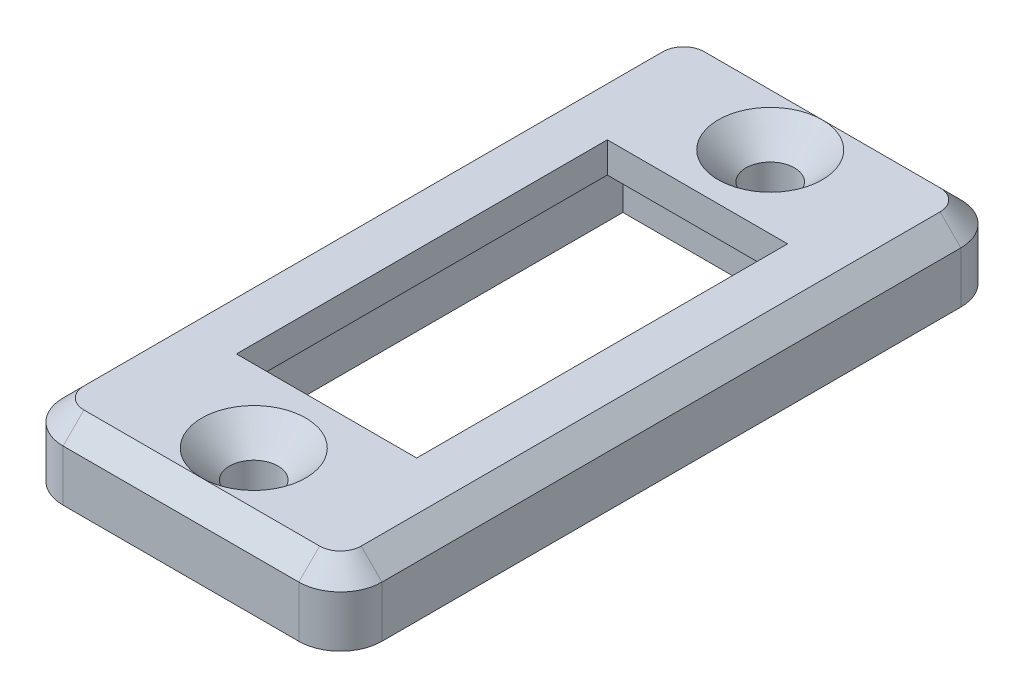
ISO-10303-21;
HEADER;
FILE_DESCRIPTION(('STEP AP214'),'2;1');
FILE_NAME('part.step','',(''),(''),'','','');
FILE_SCHEMA(('AUTOMOTIVE_DESIGN { 1 0 10303 214 1 1 1 1 }'));
ENDSEC;
DATA;
#1=APPLICATION_CONTEXT('core data for automotive mechanical design processes');
#2=APPLICATION_PROTOCOL_DEFINITION('international standard','automotive_design',2000,#1);
#3=PRODUCT_CONTEXT('',#1,'mechanical');
#4=PRODUCT('Part','Part','',(#3));
#5=PRODUCT_RELATED_PRODUCT_CATEGORY('part','',(#4));
#6=PRODUCT_DEFINITION_FORMATION('','',#4);
#7=PRODUCT_DEFINITION_CONTEXT('part definition',#1,'design');
#8=PRODUCT_DEFINITION('design','',#6,#7);
#9=PRODUCT_DEFINITION_SHAPE('','',#8);
#10=(LENGTH_UNIT() NAMED_UNIT(*) SI_UNIT(.MILLI.,.METRE.));
#11=(NAMED_UNIT(*) PLANE_ANGLE_UNIT() SI_UNIT($,.RADIAN.));
#12=(NAMED_UNIT(*) SI_UNIT($,.STERADIAN.) SOLID_ANGLE_UNIT());
#13=UNCERTAINTY_MEASURE_WITH_UNIT(LENGTH_MEASURE(1.E-05),#10,'distance_accuracy_value','');
#14=(GEOMETRIC_REPRESENTATION_CONTEXT(3) GLOBAL_UNCERTAINTY_ASSIGNED_CONTEXT((#13)) GLOBAL_UNIT_ASSIGNED_CONTEXT((#10,
#11,#12)) REPRESENTATION_CONTEXT('',''));
#15=CARTESIAN_POINT('',(0.,0.,0.));
#16=DIRECTION('',(0.,0.,1.));
#17=DIRECTION('',(1.,0.,0.));
#18=AXIS2_PLACEMENT_3D('',#15,#16,#17);
#19=CARTESIAN_POINT('',(8.5,0.,20.875));
#20=DIRECTION('',(0.,-1.,0.));
#21=DIRECTION('',(0.,0.,-1.));
#22=AXIS2_PLACEMENT_3D('',#19,#20,#21);
#23=PLANE('',#22);
#24=DIRECTION('',(-1.,0.,0.));
#25=VECTOR('',#24,1.);
#26=CARTESIAN_POINT('',(6.5,0.,-13.375));
#27=LINE('',#26,#25);
#28=CARTESIAN_POINT('',(6.5,0.,-13.375));
#29=VERTEX_POINT('',#28);
#30=CARTESIAN_POINT('',(-6.5,0.,-13.375));
#31=VERTEX_POINT('',#30);
#32=EDGE_CURVE('E254',#29,#31,#27,.T.);
#33=ORIENTED_EDGE('',*,*,#32,.T.);
#34=DIRECTION('',(0.,0.,1.));
#35=VECTOR('',#34,1.);
#36=CARTESIAN_POINT('',(-6.5,0.,13.375));
#37=LINE('',#36,#35);
#38=CARTESIAN_POINT('',(-6.5,0.,13.375));
#39=VERTEX_POINT('',#38);
#40=EDGE_CURVE('E250',#31,#39,#37,.T.);
#41=ORIENTED_EDGE('',*,*,#40,.T.);
#42=DIRECTION('',(1.,0.,0.));
#43=VECTOR('',#42,1.);
#44=CARTESIAN_POINT('',(6.5,0.,13.375));
#45=LINE('',#44,#43);
#46=CARTESIAN_POINT('',(6.5,0.,13.375));
#47=VERTEX_POINT('',#46);
#48=EDGE_CURVE('E264',#39,#47,#45,.T.);
#49=ORIENTED_EDGE('',*,*,#48,.T.);
#50=DIRECTION('',(0.,0.,-1.));
#51=VECTOR('',#50,1.);
#52=CARTESIAN_POINT('',(6.5,0.,13.375));
#53=LINE('',#52,#51);
#54=EDGE_CURVE('E267',#47,#29,#53,.T.);
#55=ORIENTED_EDGE('',*,*,#54,.T.);
#56=EDGE_LOOP('',(#33,#41,#49,#55));
#57=FACE_BOUND('',#56,.T.);
#58=DIRECTION('',(1.,0.,0.));
#59=VECTOR('',#58,1.);
#60=CARTESIAN_POINT('',(-6.6,0.,-14.6));
#61=LINE('',#60,#59);
#62=CARTESIAN_POINT('',(-6.6,0.,-14.6));
#63=VERTEX_POINT('',#62);
#64=CARTESIAN_POINT('',(6.6,0.,-14.6));
#65=VERTEX_POINT('',#64);
#66=EDGE_CURVE('E190',#63,#65,#61,.T.);
#67=ORIENTED_EDGE('',*,*,#66,.T.);
#68=DIRECTION('',(0.,0.,1.));
#69=VECTOR('',#68,1.);
#70=CARTESIAN_POINT('',(6.6,0.,-14.6));
#71=LINE('',#70,#69);
#72=CARTESIAN_POINT('',(6.6,0.,14.6));
#73=VERTEX_POINT('',#72);
#74=EDGE_CURVE('E209',#65,#73,#71,.T.);
#75=ORIENTED_EDGE('',*,*,#74,.T.);
#76=DIRECTION('',(-1.,0.,0.));
#77=VECTOR('',#76,1.);
#78=CARTESIAN_POINT('',(-6.6,0.,14.6));
#79=LINE('',#78,#77);
#80=CARTESIAN_POINT('',(-6.6,0.,14.6));
#81=VERTEX_POINT('',#80);
#82=EDGE_CURVE('E196',#73,#81,#79,.T.);
#83=ORIENTED_EDGE('',*,*,#82,.T.);
#84=DIRECTION('',(0.,0.,-1.));
#85=VECTOR('',#84,1.);
#86=CARTESIAN_POINT('',(-6.6,0.,-14.6));
#87=LINE('',#86,#85);
#88=EDGE_CURVE('E212',#81,#63,#87,.T.);
#89=ORIENTED_EDGE('',*,*,#88,.T.);
#90=EDGE_LOOP('',(#67,#75,#83,#89));
#91=FACE_BOUND('',#90,.T.);
#92=ADVANCED_FACE('F35',(#57,#91),#23,.T.);
#93=CARTESIAN_POINT('',(8.5,2.2,20.875));
#94=DIRECTION('',(0.,-1.,0.));
#95=DIRECTION('',(0.,0.,-1.));
#96=AXIS2_PLACEMENT_3D('',#93,#94,#95);
#97=PLANE('',#96);
#98=DIRECTION('',(-1.,0.,0.));
#99=VECTOR('',#98,1.);
#100=CARTESIAN_POINT('',(8.5,2.2,-22.375));
#101=LINE('',#100,#99);
#102=CARTESIAN_POINT('',(0.,2.2,-22.375));
#103=VERTEX_POINT('',#102);
#104=CARTESIAN_POINT('',(-8.49999999999999,2.2,-22.375));
#105=VERTEX_POINT('',#104);
#106=EDGE_CURVE('E326',#103,#105,#101,.T.);
#107=ORIENTED_EDGE('',*,*,#106,.T.);
#108=CARTESIAN_POINT('',(-8.5,2.2,-20.875));
#109=DIRECTION('',(0.,-1.,0.));
#110=DIRECTION('',(0.,0.,-1.));
#111=AXIS2_PLACEMENT_3D('',#108,#109,#110);
#112=CIRCLE('',#111,1.5);
#113=CARTESIAN_POINT('',(-10.,2.2,-20.875));
#114=VERTEX_POINT('',#113);
#115=EDGE_CURVE('E328',#105,#114,#112,.F.);
#116=ORIENTED_EDGE('',*,*,#115,.T.);
#117=DIRECTION('',(0.,0.,1.));
#118=VECTOR('',#117,1.);
#119=CARTESIAN_POINT('',(-10.,2.2,20.875));
#120=LINE('',#119,#118);
#121=CARTESIAN_POINT('',(-9.99999999999999,2.2,20.875));
#122=VERTEX_POINT('',#121);
#123=EDGE_CURVE('E323',#114,#122,#120,.T.);
#124=ORIENTED_EDGE('',*,*,#123,.T.);
#125=CARTESIAN_POINT('',(-8.5,2.2,20.875));
#126=DIRECTION('',(0.,-1.,0.));
#127=DIRECTION('',(0.,0.,-1.));
#128=AXIS2_PLACEMENT_3D('',#125,#126,#127);
#129=CIRCLE('',#128,1.5);
#130=CARTESIAN_POINT('',(-8.5,2.2,22.375));
#131=VERTEX_POINT('',#130);
#132=EDGE_CURVE('E321',#122,#131,#129,.F.);
#133=ORIENTED_EDGE('',*,*,#132,.T.);
#134=DIRECTION('',(1.,0.,0.));
#135=VECTOR('',#134,1.);
#136=CARTESIAN_POINT('',(8.5,2.2,22.375));
#137=LINE('',#136,#135);
#138=CARTESIAN_POINT('',(0.,2.2,22.375));
#139=VERTEX_POINT('',#138);
#140=EDGE_CURVE('E319',#131,#139,#137,.T.);
#141=ORIENTED_EDGE('',*,*,#140,.T.);
#142=CARTESIAN_POINT('',(0.,2.2,18.625));
#143=DIRECTION('',(0.,-1.,0.));
#144=DIRECTION('',(0.,0.,-1.));
#145=AXIS2_PLACEMENT_3D('',#142,#143,#144);
#146=CIRCLE('',#145,3.75);
#147=EDGE_CURVE('E300',#139,#139,#146,.T.);
#148=ORIENTED_EDGE('',*,*,#147,.T.);
#149=DIRECTION('',(1.,0.,0.));
#150=VECTOR('',#149,1.);
#151=CARTESIAN_POINT('',(8.5,2.2,22.375));
#152=LINE('',#151,#150);
#153=CARTESIAN_POINT('',(8.49999999999998,2.2,22.375));
#154=VERTEX_POINT('',#153);
#155=EDGE_CURVE('E317',#139,#154,#152,.T.);
#156=ORIENTED_EDGE('',*,*,#155,.T.);
#157=CARTESIAN_POINT('',(8.5,2.2,20.875));
#158=DIRECTION('',(0.,-1.,0.));
#159=DIRECTION('',(0.,0.,-1.));
#160=AXIS2_PLACEMENT_3D('',#157,#158,#159);
#161=CIRCLE('',#160,1.5);
#162=CARTESIAN_POINT('',(10.,2.2,20.875));
#163=VERTEX_POINT('',#162);
#164=EDGE_CURVE('E313',#154,#163,#161,.F.);
#165=ORIENTED_EDGE('',*,*,#164,.T.);
#166=DIRECTION('',(0.,0.,-1.));
#167=VECTOR('',#166,1.);
#168=CARTESIAN_POINT('',(10.,2.2,20.875));
#169=LINE('',#168,#167);
#170=CARTESIAN_POINT('',(10.,2.2,-20.875));
#171=VERTEX_POINT('',#170);
#172=EDGE_CURVE('E309',#163,#171,#169,.T.);
#173=ORIENTED_EDGE('',*,*,#172,.T.);
#174=CARTESIAN_POINT('',(8.5,2.2,-20.875));
#175=DIRECTION('',(0.,-1.,0.));
#176=DIRECTION('',(0.,0.,-1.));
#177=AXIS2_PLACEMENT_3D('',#174,#175,#176);
#178=CIRCLE('',#177,1.5);
#179=CARTESIAN_POINT('',(8.49999999999998,2.2,-22.375));
#180=VERTEX_POINT('',#179);
#181=EDGE_CURVE('E311',#171,#180,#178,.F.);
#182=ORIENTED_EDGE('',*,*,#181,.T.);
#183=DIRECTION('',(-1.,0.,0.));
#184=VECTOR('',#183,1.);
#185=CARTESIAN_POINT('',(8.5,2.2,-22.375));
#186=LINE('',#185,#184);
#187=EDGE_CURVE('E315',#180,#103,#186,.T.);
#188=ORIENTED_EDGE('',*,*,#187,.T.);
#189=CARTESIAN_POINT('',(0.,2.2,-18.625));
#190=DIRECTION('',(0.,-1.,0.));
#191=DIRECTION('',(0.,0.,-1.));
#192=AXIS2_PLACEMENT_3D('',#189,#190,#191);
#193=CIRCLE('',#192,3.75);
#194=EDGE_CURVE('E303',#103,#103,#193,.T.);
#195=ORIENTED_EDGE('',*,*,#194,.T.);
#196=EDGE_LOOP('',(#107,#116,#124,#133,#141,#148,#156,#165,#173,#182,#188,#195));
#197=FACE_BOUND('',#196,.T.);
#198=DIRECTION('',(0.,0.,1.));
#199=VECTOR('',#198,1.);
#200=CARTESIAN_POINT('',(-6.5,2.2,13.375));
#201=LINE('',#200,#199);
#202=CARTESIAN_POINT('',(-6.5,2.2,-13.375));
#203=VERTEX_POINT('',#202);
#204=CARTESIAN_POINT('',(-6.5,2.2,13.375));
#205=VERTEX_POINT('',#204);
#206=EDGE_CURVE('E251',#203,#205,#201,.T.);
#207=ORIENTED_EDGE('',*,*,#206,.F.);
#208=DIRECTION('',(-1.,0.,0.));
#209=VECTOR('',#208,1.);
#210=CARTESIAN_POINT('',(6.5,2.2,-13.375));
#211=LINE('',#210,#209);
#212=CARTESIAN_POINT('',(6.5,2.2,-13.375));
#213=VERTEX_POINT('',#212);
#214=EDGE_CURVE('E259',#213,#203,#211,.T.);
#215=ORIENTED_EDGE('',*,*,#214,.F.);
#216=DIRECTION('',(0.,0.,-1.));
#217=VECTOR('',#216,1.);
#218=CARTESIAN_POINT('',(6.5,2.2,13.375));
#219=LINE('',#218,#217);
#220=CARTESIAN_POINT('',(6.5,2.2,13.375));
#221=VERTEX_POINT('',#220);
#222=EDGE_CURVE('E256',#221,#213,#219,.T.);
#223=ORIENTED_EDGE('',*,*,#222,.F.);
#224=DIRECTION('',(1.,0.,0.));
#225=VECTOR('',#224,1.);
#226=CARTESIAN_POINT('',(6.5,2.2,13.375));
#227=LINE('',#226,#225);
#228=EDGE_CURVE('E253',#205,#221,#227,.T.);
#229=ORIENTED_EDGE('',*,*,#228,.F.);
#230=EDGE_LOOP('',(#207,#215,#223,#229));
#231=FACE_BOUND('',#230,.T.);
#232=ADVANCED_FACE('F408',(#197,#231),#97,.F.);
#233=CARTESIAN_POINT('',(8.5,2.2,20.875));
#234=DIRECTION('',(0.,-1.,0.));
#235=DIRECTION('',(0.,0.,-1.));
#236=AXIS2_PLACEMENT_3D('',#233,#234,#235);
#237=CYLINDRICAL_SURFACE('',#236,3.);
#238=DIRECTION('',(0.,-1.,0.));
#239=VECTOR('',#238,1.);
#240=CARTESIAN_POINT('',(11.5,2.2,20.875));
#241=LINE('',#240,#239);
#242=CARTESIAN_POINT('',(11.5,0.699999999999999,20.875));
#243=VERTEX_POINT('',#242);
#244=CARTESIAN_POINT('',(11.5,-3.,20.875));
#245=VERTEX_POINT('',#244);
#246=EDGE_CURVE('E295',#243,#245,#241,.T.);
#247=ORIENTED_EDGE('',*,*,#246,.F.);
#248=CARTESIAN_POINT('',(8.5,0.699999999999999,20.875));
#249=DIRECTION('',(0.,-1.,0.));
#250=DIRECTION('',(0.,0.,-1.));
#251=AXIS2_PLACEMENT_3D('',#248,#249,#250);
#252=CIRCLE('',#251,3.);
#253=CARTESIAN_POINT('',(8.49999999999998,0.699999999999999,23.875));
#254=VERTEX_POINT('',#253);
#255=EDGE_CURVE('E341',#243,#254,#252,.T.);
#256=ORIENTED_EDGE('',*,*,#255,.T.);
#257=DIRECTION('',(0.,-1.,0.));
#258=VECTOR('',#257,1.);
#259=CARTESIAN_POINT('',(8.49999999999998,2.2,23.875));
#260=LINE('',#259,#258);
#261=CARTESIAN_POINT('',(8.49999999999998,-3.,23.875));
#262=VERTEX_POINT('',#261);
#263=EDGE_CURVE('E281',#254,#262,#260,.T.);
#264=ORIENTED_EDGE('',*,*,#263,.T.);
#265=CARTESIAN_POINT('',(8.5,-3.,20.875));
#266=DIRECTION('',(0.,-1.,0.));
#267=DIRECTION('',(0.,0.,-1.));
#268=AXIS2_PLACEMENT_3D('',#265,#266,#267);
#269=CIRCLE('',#268,3.);
#270=EDGE_CURVE('E232',#245,#262,#269,.T.);
#271=ORIENTED_EDGE('',*,*,#270,.F.);
#272=EDGE_LOOP('',(#247,#256,#264,#271));
#273=FACE_BOUND('',#272,.T.);
#274=ADVANCED_FACE('F378',(#273),#237,.T.);
#275=CARTESIAN_POINT('',(11.5,2.2,20.875));
#276=DIRECTION('',(-1.,0.,0.));
#277=DIRECTION('',(0.,0.,1.));
#278=AXIS2_PLACEMENT_3D('',#275,#276,#277);
#279=PLANE('',#278);
#280=DIRECTION('',(0.,-1.,0.));
#281=VECTOR('',#280,1.);
#282=CARTESIAN_POINT('',(11.5,2.2,-20.875));
#283=LINE('',#282,#281);
#284=CARTESIAN_POINT('',(11.5,0.699999999999999,-20.875));
#285=VERTEX_POINT('',#284);
#286=CARTESIAN_POINT('',(11.5,-3.,-20.875));
#287=VERTEX_POINT('',#286);
#288=EDGE_CURVE('E293',#285,#287,#283,.T.);
#289=ORIENTED_EDGE('',*,*,#288,.F.);
#290=DIRECTION('',(0.,0.,1.));
#291=VECTOR('',#290,1.);
#292=CARTESIAN_POINT('',(11.5,0.699999999999999,20.875));
#293=LINE('',#292,#291);
#294=EDGE_CURVE('E11',#285,#243,#293,.T.);
#295=ORIENTED_EDGE('',*,*,#294,.T.);
#296=ORIENTED_EDGE('',*,*,#246,.T.);
#297=DIRECTION('',(0.,0.,1.));
#298=VECTOR('',#297,1.);
#299=CARTESIAN_POINT('',(11.5,-3.,20.875));
#300=LINE('',#299,#298);
#301=EDGE_CURVE('E229',#287,#245,#300,.T.);
#302=ORIENTED_EDGE('',*,*,#301,.F.);
#303=EDGE_LOOP('',(#289,#295,#296,#302));
#304=FACE_BOUND('',#303,.T.);
#305=ADVANCED_FACE('F480',(#304),#279,.F.);
#306=CARTESIAN_POINT('',(8.5,2.2,-20.875));
#307=DIRECTION('',(0.,-1.,0.));
#308=DIRECTION('',(0.,0.,-1.));
#309=AXIS2_PLACEMENT_3D('',#306,#307,#308);
#310=CYLINDRICAL_SURFACE('',#309,3.);
#311=DIRECTION('',(0.,-1.,0.));
#312=VECTOR('',#311,1.);
#313=CARTESIAN_POINT('',(8.49999999999998,2.2,-23.875));
#314=LINE('',#313,#312);
#315=CARTESIAN_POINT('',(8.49999999999998,0.699999999999998,-23.875));
#316=VERTEX_POINT('',#315);
#317=CARTESIAN_POINT('',(8.49999999999998,-3.,-23.875));
#318=VERTEX_POINT('',#317);
#319=EDGE_CURVE('E291',#316,#318,#314,.T.);
#320=ORIENTED_EDGE('',*,*,#319,.F.);
#321=CARTESIAN_POINT('',(8.5,0.699999999999998,-20.875));
#322=DIRECTION('',(0.,-1.,0.));
#323=DIRECTION('',(0.,0.,-1.));
#324=AXIS2_PLACEMENT_3D('',#321,#322,#323);
#325=CIRCLE('',#324,3.);
#326=EDGE_CURVE('E44',#316,#285,#325,.T.);
#327=ORIENTED_EDGE('',*,*,#326,.T.);
#328=ORIENTED_EDGE('',*,*,#288,.T.);
#329=CARTESIAN_POINT('',(8.5,-3.,-20.875));
#330=DIRECTION('',(0.,-1.,0.));
#331=DIRECTION('',(0.,0.,-1.));
#332=AXIS2_PLACEMENT_3D('',#329,#330,#331);
#333=CIRCLE('',#332,3.);
#334=EDGE_CURVE('E226',#318,#287,#333,.T.);
#335=ORIENTED_EDGE('',*,*,#334,.F.);
#336=EDGE_LOOP('',(#320,#327,#328,#335));
#337=FACE_BOUND('',#336,.T.);
#338=ADVANCED_FACE('F477',(#337),#310,.T.);
#339=CARTESIAN_POINT('',(8.49999999999998,2.2,-23.875));
#340=DIRECTION('',(0.,0.,1.));
#341=DIRECTION('',(1.,0.,0.));
#342=AXIS2_PLACEMENT_3D('',#339,#340,#341);
#343=PLANE('',#342);
#344=DIRECTION('',(0.,-1.,0.));
#345=VECTOR('',#344,1.);
#346=CARTESIAN_POINT('',(-8.49999999999998,2.2,-23.875));
#347=LINE('',#346,#345);
#348=CARTESIAN_POINT('',(-8.49999999999998,0.699999999999999,-23.875));
#349=VERTEX_POINT('',#348);
#350=CARTESIAN_POINT('',(-8.49999999999998,-3.,-23.875));
#351=VERTEX_POINT('',#350);
#352=EDGE_CURVE('E289',#349,#351,#347,.T.);
#353=ORIENTED_EDGE('',*,*,#352,.F.);
#354=DIRECTION('',(1.,0.,0.));
#355=VECTOR('',#354,1.);
#356=CARTESIAN_POINT('',(8.49999999999998,0.699999999999999,-23.875));
#357=LINE('',#356,#355);
#358=EDGE_CURVE('E339',#349,#316,#357,.T.);
#359=ORIENTED_EDGE('',*,*,#358,.T.);
#360=ORIENTED_EDGE('',*,*,#319,.T.);
#361=DIRECTION('',(1.,0.,0.));
#362=VECTOR('',#361,1.);
#363=CARTESIAN_POINT('',(8.49999999999998,-3.,-23.875));
#364=LINE('',#363,#362);
#365=EDGE_CURVE('E247',#351,#318,#364,.T.);
#366=ORIENTED_EDGE('',*,*,#365,.F.);
#367=EDGE_LOOP('',(#353,#359,#360,#366));
#368=FACE_BOUND('',#367,.T.);
#369=ADVANCED_FACE('F422',(#368),#343,.F.);
#370=CARTESIAN_POINT('',(-8.5,2.2,-20.875));
#371=DIRECTION('',(0.,-1.,0.));
#372=DIRECTION('',(0.,0.,-1.));
#373=AXIS2_PLACEMENT_3D('',#370,#371,#372);
#374=CYLINDRICAL_SURFACE('',#373,3.);
#375=DIRECTION('',(0.,-1.,0.));
#376=VECTOR('',#375,1.);
#377=CARTESIAN_POINT('',(-11.5,2.2,-20.875));
#378=LINE('',#377,#376);
#379=CARTESIAN_POINT('',(-11.5,0.699999999999999,-20.875));
#380=VERTEX_POINT('',#379);
#381=CARTESIAN_POINT('',(-11.5,-3.,-20.875));
#382=VERTEX_POINT('',#381);
#383=EDGE_CURVE('E287',#380,#382,#378,.T.);
#384=ORIENTED_EDGE('',*,*,#383,.F.);
#385=CARTESIAN_POINT('',(-8.5,0.699999999999999,-20.875));
#386=DIRECTION('',(0.,-1.,0.));
#387=DIRECTION('',(0.,0.,-1.));
#388=AXIS2_PLACEMENT_3D('',#385,#386,#387);
#389=CIRCLE('',#388,3.);
#390=EDGE_CURVE('E335',#380,#349,#389,.T.);
#391=ORIENTED_EDGE('',*,*,#390,.T.);
#392=ORIENTED_EDGE('',*,*,#352,.T.);
#393=CARTESIAN_POINT('',(-8.5,-3.,-20.875));
#394=DIRECTION('',(0.,-1.,0.));
#395=DIRECTION('',(0.,0.,-1.));
#396=AXIS2_PLACEMENT_3D('',#393,#394,#395);
#397=CIRCLE('',#396,3.);
#398=EDGE_CURVE('E244',#382,#351,#397,.T.);
#399=ORIENTED_EDGE('',*,*,#398,.F.);
#400=EDGE_LOOP('',(#384,#391,#392,#399));
#401=FACE_BOUND('',#400,.T.);
#402=ADVANCED_FACE('F417',(#401),#374,.T.);
#403=CARTESIAN_POINT('',(-11.5,2.2,20.875));
#404=DIRECTION('',(1.,0.,0.));
#405=DIRECTION('',(0.,0.,-1.));
#406=AXIS2_PLACEMENT_3D('',#403,#404,#405);
#407=PLANE('',#406);
#408=DIRECTION('',(0.,-1.,0.));
#409=VECTOR('',#408,1.);
#410=CARTESIAN_POINT('',(-11.5,2.2,20.875));
#411=LINE('',#410,#409);
#412=CARTESIAN_POINT('',(-11.5,0.699999999999999,20.875));
#413=VERTEX_POINT('',#412);
#414=CARTESIAN_POINT('',(-11.5,-3.,20.875));
#415=VERTEX_POINT('',#414);
#416=EDGE_CURVE('E285',#413,#415,#411,.T.);
#417=ORIENTED_EDGE('',*,*,#416,.F.);
#418=DIRECTION('',(0.,0.,-1.));
#419=VECTOR('',#418,1.);
#420=CARTESIAN_POINT('',(-11.5,0.699999999999999,20.875));
#421=LINE('',#420,#419);
#422=EDGE_CURVE('E330',#413,#380,#421,.T.);
#423=ORIENTED_EDGE('',*,*,#422,.T.);
#424=ORIENTED_EDGE('',*,*,#383,.T.);
#425=DIRECTION('',(0.,0.,-1.));
#426=VECTOR('',#425,1.);
#427=CARTESIAN_POINT('',(-11.5,-3.,-20.875));
#428=LINE('',#427,#426);
#429=EDGE_CURVE('E241',#415,#382,#428,.T.);
#430=ORIENTED_EDGE('',*,*,#429,.F.);
#431=EDGE_LOOP('',(#417,#423,#424,#430));
#432=FACE_BOUND('',#431,.T.);
#433=ADVANCED_FACE('F395',(#432),#407,.F.);
#434=CARTESIAN_POINT('',(-8.5,2.2,20.875));
#435=DIRECTION('',(0.,-1.,0.));
#436=DIRECTION('',(0.,0.,-1.));
#437=AXIS2_PLACEMENT_3D('',#434,#435,#436);
#438=CYLINDRICAL_SURFACE('',#437,3.);
#439=DIRECTION('',(0.,-1.,0.));
#440=VECTOR('',#439,1.);
#441=CARTESIAN_POINT('',(-8.5,2.2,23.875));
#442=LINE('',#441,#440);
#443=CARTESIAN_POINT('',(-8.5,0.699999999999999,23.875));
#444=VERTEX_POINT('',#443);
#445=CARTESIAN_POINT('',(-8.5,-3.,23.875));
#446=VERTEX_POINT('',#445);
#447=EDGE_CURVE('E283',#444,#446,#442,.T.);
#448=ORIENTED_EDGE('',*,*,#447,.F.);
#449=CARTESIAN_POINT('',(-8.5,0.699999999999999,20.875));
#450=DIRECTION('',(0.,-1.,0.));
#451=DIRECTION('',(0.,0.,-1.));
#452=AXIS2_PLACEMENT_3D('',#449,#450,#451);
#453=CIRCLE('',#452,3.);
#454=EDGE_CURVE('E333',#444,#413,#453,.T.);
#455=ORIENTED_EDGE('',*,*,#454,.T.);
#456=ORIENTED_EDGE('',*,*,#416,.T.);
#457=CARTESIAN_POINT('',(-8.5,-3.,20.875));
#458=DIRECTION('',(0.,-1.,0.));
#459=DIRECTION('',(0.,0.,-1.));
#460=AXIS2_PLACEMENT_3D('',#457,#458,#459);
#461=CIRCLE('',#460,3.);
#462=EDGE_CURVE('E238',#446,#415,#461,.T.);
#463=ORIENTED_EDGE('',*,*,#462,.F.);
#464=EDGE_LOOP('',(#448,#455,#456,#463));
#465=FACE_BOUND('',#464,.T.);
#466=ADVANCED_FACE('F389',(#465),#438,.T.);
#467=CARTESIAN_POINT('',(8.49999999999998,2.2,23.875));
#468=DIRECTION('',(0.,0.,-1.));
#469=DIRECTION('',(-1.,0.,0.));
#470=AXIS2_PLACEMENT_3D('',#467,#468,#469);
#471=PLANE('',#470);
#472=ORIENTED_EDGE('',*,*,#263,.F.);
#473=DIRECTION('',(-1.,0.,0.));
#474=VECTOR('',#473,1.);
#475=CARTESIAN_POINT('',(8.49999999999998,0.699999999999999,23.875));
#476=LINE('',#475,#474);
#477=EDGE_CURVE('E337',#254,#444,#476,.T.);
#478=ORIENTED_EDGE('',*,*,#477,.T.);
#479=ORIENTED_EDGE('',*,*,#447,.T.);
#480=DIRECTION('',(-1.,0.,0.));
#481=VECTOR('',#480,1.);
#482=CARTESIAN_POINT('',(-8.5,-3.,23.875));
#483=LINE('',#482,#481);
#484=EDGE_CURVE('E235',#262,#446,#483,.T.);
#485=ORIENTED_EDGE('',*,*,#484,.F.);
#486=EDGE_LOOP('',(#472,#478,#479,#485));
#487=FACE_BOUND('',#486,.T.);
#488=ADVANCED_FACE('F382',(#487),#471,.F.);
#489=CARTESIAN_POINT('',(-6.5,2.2,13.375));
#490=DIRECTION('',(1.,0.,0.));
#491=DIRECTION('',(0.,0.,-1.));
#492=AXIS2_PLACEMENT_3D('',#489,#490,#491);
#493=PLANE('',#492);
#494=ORIENTED_EDGE('',*,*,#40,.F.);
#495=DIRECTION('',(0.,-1.,0.));
#496=VECTOR('',#495,1.);
#497=CARTESIAN_POINT('',(-6.5,2.2,-13.375));
#498=LINE('',#497,#496);
#499=EDGE_CURVE('E261',#203,#31,#498,.T.);
#500=ORIENTED_EDGE('',*,*,#499,.F.);
#501=ORIENTED_EDGE('',*,*,#206,.T.);
#502=DIRECTION('',(0.,-1.,0.));
#503=VECTOR('',#502,1.);
#504=CARTESIAN_POINT('',(-6.5,2.2,13.375));
#505=LINE('',#504,#503);
#506=EDGE_CURVE('E278',#205,#39,#505,.T.);
#507=ORIENTED_EDGE('',*,*,#506,.T.);
#508=EDGE_LOOP('',(#494,#500,#501,#507));
#509=FACE_BOUND('',#508,.T.);
#510=ADVANCED_FACE('F468',(#509),#493,.T.);
#511=CARTESIAN_POINT('',(6.5,2.2,13.375));
#512=DIRECTION('',(0.,0.,-1.));
#513=DIRECTION('',(-1.,0.,0.));
#514=AXIS2_PLACEMENT_3D('',#511,#512,#513);
#515=PLANE('',#514);
#516=ORIENTED_EDGE('',*,*,#48,.F.);
#517=ORIENTED_EDGE('',*,*,#506,.F.);
#518=ORIENTED_EDGE('',*,*,#228,.T.);
#519=DIRECTION('',(0.,-1.,0.));
#520=VECTOR('',#519,1.);
#521=CARTESIAN_POINT('',(6.5,2.2,13.375));
#522=LINE('',#521,#520);
#523=EDGE_CURVE('E276',#221,#47,#522,.T.);
#524=ORIENTED_EDGE('',*,*,#523,.T.);
#525=EDGE_LOOP('',(#516,#517,#518,#524));
#526=FACE_BOUND('',#525,.T.);
#527=ADVANCED_FACE('F572',(#526),#515,.T.);
#528=CARTESIAN_POINT('',(6.5,2.2,13.375));
#529=DIRECTION('',(-1.,0.,0.));
#530=DIRECTION('',(0.,0.,1.));
#531=AXIS2_PLACEMENT_3D('',#528,#529,#530);
#532=PLANE('',#531);
#533=ORIENTED_EDGE('',*,*,#54,.F.);
#534=ORIENTED_EDGE('',*,*,#523,.F.);
#535=ORIENTED_EDGE('',*,*,#222,.T.);
#536=DIRECTION('',(0.,-1.,0.));
#537=VECTOR('',#536,1.);
#538=CARTESIAN_POINT('',(6.5,2.2,-13.375));
#539=LINE('',#538,#537);
#540=EDGE_CURVE('E274',#213,#29,#539,.T.);
#541=ORIENTED_EDGE('',*,*,#540,.T.);
#542=EDGE_LOOP('',(#533,#534,#535,#541));
#543=FACE_BOUND('',#542,.T.);
#544=ADVANCED_FACE('F561',(#543),#532,.T.);
#545=CARTESIAN_POINT('',(6.5,2.2,-13.375));
#546=DIRECTION('',(0.,0.,1.));
#547=DIRECTION('',(1.,0.,0.));
#548=AXIS2_PLACEMENT_3D('',#545,#546,#547);
#549=PLANE('',#548);
#550=ORIENTED_EDGE('',*,*,#32,.F.);
#551=ORIENTED_EDGE('',*,*,#540,.F.);
#552=ORIENTED_EDGE('',*,*,#214,.T.);
#553=ORIENTED_EDGE('',*,*,#499,.T.);
#554=EDGE_LOOP('',(#550,#551,#552,#553));
#555=FACE_BOUND('',#554,.T.);
#556=ADVANCED_FACE('F443',(#555),#549,.T.);
#557=CARTESIAN_POINT('',(0.,2.2,18.625));
#558=DIRECTION('',(0.,-1.,0.));
#559=DIRECTION('',(0.,0.,-1.));
#560=AXIS2_PLACEMENT_3D('',#557,#558,#559);
#561=CYLINDRICAL_SURFACE('',#560,1.75);
#562=CARTESIAN_POINT('',(0.,0.199999999999999,18.625));
#563=DIRECTION('',(0.,-1.,0.));
#564=DIRECTION('',(0.,0.,-1.));
#565=AXIS2_PLACEMENT_3D('',#562,#563,#564);
#566=CIRCLE('',#565,1.75);
#567=CARTESIAN_POINT('',(0.,0.199999999999999,16.875));
#568=VERTEX_POINT('',#567);
#569=EDGE_CURVE('E306',#568,#568,#566,.F.);
#570=ORIENTED_EDGE('',*,*,#569,.T.);
#571=EDGE_LOOP('',(#570));
#572=FACE_BOUND('',#571,.T.);
#573=CARTESIAN_POINT('',(0.,-3.,18.625));
#574=DIRECTION('',(0.,-1.,0.));
#575=DIRECTION('',(0.,0.,-1.));
#576=AXIS2_PLACEMENT_3D('',#573,#574,#575);
#577=CIRCLE('',#576,1.75);
#578=CARTESIAN_POINT('',(0.,-3.,16.875));
#579=VERTEX_POINT('',#578);
#580=EDGE_CURVE('E223',#579,#579,#577,.T.);
#581=ORIENTED_EDGE('',*,*,#580,.T.);
#582=EDGE_LOOP('',(#581));
#583=FACE_BOUND('',#582,.T.);
#584=ADVANCED_FACE('F439',(#572,#583),#561,.F.);
#585=CARTESIAN_POINT('',(0.,2.2,-18.625));
#586=DIRECTION('',(0.,-1.,0.));
#587=DIRECTION('',(0.,0.,-1.));
#588=AXIS2_PLACEMENT_3D('',#585,#586,#587);
#589=CYLINDRICAL_SURFACE('',#588,1.75);
#590=CARTESIAN_POINT('',(0.,0.199999999999999,-18.625));
#591=DIRECTION('',(0.,-1.,0.));
#592=DIRECTION('',(0.,0.,-1.));
#593=AXIS2_PLACEMENT_3D('',#590,#591,#592);
#594=CIRCLE('',#593,1.75);
#595=CARTESIAN_POINT('',(0.,0.199999999999999,-20.375));
#596=VERTEX_POINT('',#595);
#597=EDGE_CURVE('E297',#596,#596,#594,.F.);
#598=ORIENTED_EDGE('',*,*,#597,.T.);
#599=EDGE_LOOP('',(#598));
#600=FACE_BOUND('',#599,.T.);
#601=CARTESIAN_POINT('',(0.,-3.,-18.625));
#602=DIRECTION('',(0.,-1.,0.));
#603=DIRECTION('',(0.,0.,-1.));
#604=AXIS2_PLACEMENT_3D('',#601,#602,#603);
#605=CIRCLE('',#604,1.75);
#606=CARTESIAN_POINT('',(0.,-3.,-20.375));
#607=VERTEX_POINT('',#606);
#608=EDGE_CURVE('E197',#607,#607,#605,.T.);
#609=ORIENTED_EDGE('',*,*,#608,.T.);
#610=EDGE_LOOP('',(#609));
#611=FACE_BOUND('',#610,.T.);
#612=ADVANCED_FACE('F442',(#600,#611),#589,.F.);
#613=CARTESIAN_POINT('',(8.5,-3.,-20.875));
#614=DIRECTION('',(0.,-1.,0.));
#615=DIRECTION('',(0.,0.,-1.));
#616=AXIS2_PLACEMENT_3D('',#613,#614,#615);
#617=PLANE('',#616);
#618=ORIENTED_EDGE('',*,*,#580,.F.);
#619=EDGE_LOOP('',(#618));
#620=FACE_BOUND('',#619,.T.);
#621=ORIENTED_EDGE('',*,*,#334,.T.);
#622=ORIENTED_EDGE('',*,*,#301,.T.);
#623=ORIENTED_EDGE('',*,*,#270,.T.);
#624=ORIENTED_EDGE('',*,*,#484,.T.);
#625=ORIENTED_EDGE('',*,*,#462,.T.);
#626=ORIENTED_EDGE('',*,*,#429,.T.);
#627=ORIENTED_EDGE('',*,*,#398,.T.);
#628=ORIENTED_EDGE('',*,*,#365,.T.);
#629=EDGE_LOOP('',(#621,#622,#623,#624,#625,#626,#627,#628));
#630=FACE_BOUND('',#629,.T.);
#631=ORIENTED_EDGE('',*,*,#608,.F.);
#632=EDGE_LOOP('',(#631));
#633=FACE_BOUND('',#632,.T.);
#634=DIRECTION('',(-1.,0.,0.));
#635=VECTOR('',#634,1.);
#636=CARTESIAN_POINT('',(-6.6,-3.,14.6));
#637=LINE('',#636,#635);
#638=CARTESIAN_POINT('',(6.6,-3.,14.6));
#639=VERTEX_POINT('',#638);
#640=CARTESIAN_POINT('',(-6.6,-3.,14.6));
#641=VERTEX_POINT('',#640);
#642=EDGE_CURVE('E189',#639,#641,#637,.T.);
#643=ORIENTED_EDGE('',*,*,#642,.F.);
#644=DIRECTION('',(0.,0.,1.));
#645=VECTOR('',#644,1.);
#646=CARTESIAN_POINT('',(6.6,-3.,-14.6));
#647=LINE('',#646,#645);
#648=CARTESIAN_POINT('',(6.6,-3.,-14.6));
#649=VERTEX_POINT('',#648);
#650=EDGE_CURVE('E179',#649,#639,#647,.T.);
#651=ORIENTED_EDGE('',*,*,#650,.F.);
#652=DIRECTION('',(1.,0.,0.));
#653=VECTOR('',#652,1.);
#654=CARTESIAN_POINT('',(-6.6,-3.,-14.6));
#655=LINE('',#654,#653);
#656=CARTESIAN_POINT('',(-6.6,-3.,-14.6));
#657=VERTEX_POINT('',#656);
#658=EDGE_CURVE('E205',#657,#649,#655,.T.);
#659=ORIENTED_EDGE('',*,*,#658,.F.);
#660=DIRECTION('',(0.,0.,-1.));
#661=VECTOR('',#660,1.);
#662=CARTESIAN_POINT('',(-6.6,-3.,-14.6));
#663=LINE('',#662,#661);
#664=EDGE_CURVE('E203',#641,#657,#663,.T.);
#665=ORIENTED_EDGE('',*,*,#664,.F.);
#666=EDGE_LOOP('',(#643,#651,#659,#665));
#667=FACE_BOUND('',#666,.T.);
#668=ADVANCED_FACE('F201',(#620,#630,#633,#667),#617,.T.);
#669=CARTESIAN_POINT('',(6.6,-3.,-14.6));
#670=DIRECTION('',(-1.,0.,0.));
#671=DIRECTION('',(0.,0.,1.));
#672=AXIS2_PLACEMENT_3D('',#669,#670,#671);
#673=PLANE('',#672);
#674=ORIENTED_EDGE('',*,*,#74,.F.);
#675=DIRECTION('',(0.,1.,0.));
#676=VECTOR('',#675,1.);
#677=CARTESIAN_POINT('',(6.6,-3.,-14.6));
#678=LINE('',#677,#676);
#679=EDGE_CURVE('E185',#649,#65,#678,.T.);
#680=ORIENTED_EDGE('',*,*,#679,.F.);
#681=ORIENTED_EDGE('',*,*,#650,.T.);
#682=DIRECTION('',(0.,1.,0.));
#683=VECTOR('',#682,1.);
#684=CARTESIAN_POINT('',(6.6,-3.,14.6));
#685=LINE('',#684,#683);
#686=EDGE_CURVE('E183',#639,#73,#685,.T.);
#687=ORIENTED_EDGE('',*,*,#686,.T.);
#688=EDGE_LOOP('',(#674,#680,#681,#687));
#689=FACE_BOUND('',#688,.T.);
#690=ADVANCED_FACE('F182',(#689),#673,.T.);
#691=CARTESIAN_POINT('',(-6.6,-3.,14.6));
#692=DIRECTION('',(0.,0.,-1.));
#693=DIRECTION('',(-1.,0.,0.));
#694=AXIS2_PLACEMENT_3D('',#691,#692,#693);
#695=PLANE('',#694);
#696=ORIENTED_EDGE('',*,*,#82,.F.);
#697=ORIENTED_EDGE('',*,*,#686,.F.);
#698=ORIENTED_EDGE('',*,*,#642,.T.);
#699=DIRECTION('',(0.,1.,0.));
#700=VECTOR('',#699,1.);
#701=CARTESIAN_POINT('',(-6.6,-3.,14.6));
#702=LINE('',#701,#700);
#703=EDGE_CURVE('E198',#641,#81,#702,.T.);
#704=ORIENTED_EDGE('',*,*,#703,.T.);
#705=EDGE_LOOP('',(#696,#697,#698,#704));
#706=FACE_BOUND('',#705,.T.);
#707=ADVANCED_FACE('F193',(#706),#695,.T.);
#708=CARTESIAN_POINT('',(-6.6,-3.,-14.6));
#709=DIRECTION('',(1.,0.,0.));
#710=DIRECTION('',(0.,0.,-1.));
#711=AXIS2_PLACEMENT_3D('',#708,#709,#710);
#712=PLANE('',#711);
#713=ORIENTED_EDGE('',*,*,#88,.F.);
#714=ORIENTED_EDGE('',*,*,#703,.F.);
#715=ORIENTED_EDGE('',*,*,#664,.T.);
#716=DIRECTION('',(0.,1.,0.));
#717=VECTOR('',#716,1.);
#718=CARTESIAN_POINT('',(-6.6,-3.,-14.6));
#719=LINE('',#718,#717);
#720=EDGE_CURVE('E218',#657,#63,#719,.T.);
#721=ORIENTED_EDGE('',*,*,#720,.T.);
#722=EDGE_LOOP('',(#713,#714,#715,#721));
#723=FACE_BOUND('',#722,.T.);
#724=ADVANCED_FACE('F521',(#723),#712,.T.);
#725=CARTESIAN_POINT('',(-6.6,-3.,-14.6));
#726=DIRECTION('',(0.,0.,1.));
#727=DIRECTION('',(1.,0.,0.));
#728=AXIS2_PLACEMENT_3D('',#725,#726,#727);
#729=PLANE('',#728);
#730=ORIENTED_EDGE('',*,*,#66,.F.);
#731=ORIENTED_EDGE('',*,*,#720,.F.);
#732=ORIENTED_EDGE('',*,*,#658,.T.);
#733=ORIENTED_EDGE('',*,*,#679,.T.);
#734=EDGE_LOOP('',(#730,#731,#732,#733));
#735=FACE_BOUND('',#734,.T.);
#736=ADVANCED_FACE('F486',(#735),#729,.T.);
#737=CARTESIAN_POINT('',(0.,0.199999999999999,-18.625));
#738=DIRECTION('',(0.,1.,0.));
#739=DIRECTION('',(0.,0.,1.));
#740=AXIS2_PLACEMENT_3D('',#737,#738,#739);
#741=CONICAL_SURFACE('',#740,1.75,0.785398163397449);
#742=ORIENTED_EDGE('',*,*,#194,.F.);
#743=EDGE_LOOP('',(#742));
#744=FACE_BOUND('',#743,.T.);
#745=ORIENTED_EDGE('',*,*,#597,.F.);
#746=EDGE_LOOP('',(#745));
#747=FACE_BOUND('',#746,.T.);
#748=ADVANCED_FACE('F435',(#744,#747),#741,.F.);
#749=CARTESIAN_POINT('',(0.,0.199999999999999,18.625));
#750=DIRECTION('',(0.,1.,0.));
#751=DIRECTION('',(0.,0.,1.));
#752=AXIS2_PLACEMENT_3D('',#749,#750,#751);
#753=CONICAL_SURFACE('',#752,1.75,0.785398163397449);
#754=ORIENTED_EDGE('',*,*,#147,.F.);
#755=EDGE_LOOP('',(#754));
#756=FACE_BOUND('',#755,.T.);
#757=ORIENTED_EDGE('',*,*,#569,.F.);
#758=EDGE_LOOP('',(#757));
#759=FACE_BOUND('',#758,.T.);
#760=ADVANCED_FACE('F432',(#756,#759),#753,.F.);
#761=CARTESIAN_POINT('',(10.,2.2,20.875));
#762=DIRECTION('',(-0.707106781186547,-0.707106781186547,0.));
#763=DIRECTION('',(0.,0.,-1.));
#764=AXIS2_PLACEMENT_3D('',#761,#762,#763);
#765=PLANE('',#764);
#766=DIRECTION('',(-0.707106781186547,0.707106781186547,0.));
#767=VECTOR('',#766,1.);
#768=CARTESIAN_POINT('',(11.5,0.699999999999999,20.875));
#769=LINE('',#768,#767);
#770=EDGE_CURVE('E359',#243,#163,#769,.T.);
#771=ORIENTED_EDGE('',*,*,#770,.F.);
#772=ORIENTED_EDGE('',*,*,#294,.F.);
#773=DIRECTION('',(0.707106781186547,-0.707106781186547,0.));
#774=VECTOR('',#773,1.);
#775=CARTESIAN_POINT('',(10.,2.2,-20.875));
#776=LINE('',#775,#774);
#777=EDGE_CURVE('E39',#171,#285,#776,.T.);
#778=ORIENTED_EDGE('',*,*,#777,.F.);
#779=ORIENTED_EDGE('',*,*,#172,.F.);
#780=EDGE_LOOP('',(#771,#772,#778,#779));
#781=FACE_BOUND('',#780,.T.);
#782=ADVANCED_FACE('F37',(#781),#765,.F.);
#783=CARTESIAN_POINT('',(8.5,2.2,-20.875));
#784=DIRECTION('',(0.,-1.,0.));
#785=DIRECTION('',(0.,0.,-1.));
#786=AXIS2_PLACEMENT_3D('',#783,#784,#785);
#787=CONICAL_SURFACE('',#786,1.5,0.785398163397448);
#788=ORIENTED_EDGE('',*,*,#777,.T.);
#789=ORIENTED_EDGE('',*,*,#326,.F.);
#790=DIRECTION('',(0.,-0.707106781186548,-0.707106781186547));
#791=VECTOR('',#790,1.);
#792=CARTESIAN_POINT('',(8.49999999999998,2.2,-22.375));
#793=LINE('',#792,#791);
#794=EDGE_CURVE('E357',#180,#316,#793,.T.);
#795=ORIENTED_EDGE('',*,*,#794,.F.);
#796=ORIENTED_EDGE('',*,*,#181,.F.);
#797=EDGE_LOOP('',(#788,#789,#795,#796));
#798=FACE_BOUND('',#797,.T.);
#799=ADVANCED_FACE('F369',(#798),#787,.T.);
#800=CARTESIAN_POINT('',(8.5,2.2,20.875));
#801=DIRECTION('',(0.,-1.,0.));
#802=DIRECTION('',(0.,0.,-1.));
#803=AXIS2_PLACEMENT_3D('',#800,#801,#802);
#804=CONICAL_SURFACE('',#803,1.5,0.785398163397449);
#805=ORIENTED_EDGE('',*,*,#770,.T.);
#806=ORIENTED_EDGE('',*,*,#164,.F.);
#807=DIRECTION('',(0.,0.707106781186547,-0.707106781186548));
#808=VECTOR('',#807,1.);
#809=CARTESIAN_POINT('',(8.49999999999998,0.699999999999999,23.875));
#810=LINE('',#809,#808);
#811=EDGE_CURVE('E354',#254,#154,#810,.T.);
#812=ORIENTED_EDGE('',*,*,#811,.F.);
#813=ORIENTED_EDGE('',*,*,#255,.F.);
#814=EDGE_LOOP('',(#805,#806,#812,#813));
#815=FACE_BOUND('',#814,.T.);
#816=ADVANCED_FACE('F374',(#815),#804,.T.);
#817=CARTESIAN_POINT('',(8.5,2.2,-22.375));
#818=DIRECTION('',(0.,-0.707106781186547,0.707106781186548));
#819=DIRECTION('',(-1.,0.,0.));
#820=AXIS2_PLACEMENT_3D('',#817,#818,#819);
#821=PLANE('',#820);
#822=ORIENTED_EDGE('',*,*,#794,.T.);
#823=ORIENTED_EDGE('',*,*,#358,.F.);
#824=DIRECTION('',(0.,-0.707106781186548,-0.707106781186547));
#825=VECTOR('',#824,1.);
#826=CARTESIAN_POINT('',(-8.49999999999999,2.2,-22.375));
#827=LINE('',#826,#825);
#828=EDGE_CURVE('E351',#105,#349,#827,.T.);
#829=ORIENTED_EDGE('',*,*,#828,.F.);
#830=ORIENTED_EDGE('',*,*,#106,.F.);
#831=ORIENTED_EDGE('',*,*,#187,.F.);
#832=EDGE_LOOP('',(#822,#823,#829,#830,#831));
#833=FACE_BOUND('',#832,.T.);
#834=ADVANCED_FACE('F424',(#833),#821,.F.);
#835=CARTESIAN_POINT('',(8.5,2.2,22.375));
#836=DIRECTION('',(0.,-0.707106781186547,-0.707106781186547));
#837=DIRECTION('',(1.,0.,0.));
#838=AXIS2_PLACEMENT_3D('',#835,#836,#837);
#839=PLANE('',#838);
#840=ORIENTED_EDGE('',*,*,#155,.F.);
#841=ORIENTED_EDGE('',*,*,#140,.F.);
#842=DIRECTION('',(0.,0.707106781186547,-0.707106781186547));
#843=VECTOR('',#842,1.);
#844=CARTESIAN_POINT('',(-8.5,0.699999999999999,23.875));
#845=LINE('',#844,#843);
#846=EDGE_CURVE('E348',#444,#131,#845,.T.);
#847=ORIENTED_EDGE('',*,*,#846,.F.);
#848=ORIENTED_EDGE('',*,*,#477,.F.);
#849=ORIENTED_EDGE('',*,*,#811,.T.);
#850=EDGE_LOOP('',(#840,#841,#847,#848,#849));
#851=FACE_BOUND('',#850,.T.);
#852=ADVANCED_FACE('F429',(#851),#839,.F.);
#853=CARTESIAN_POINT('',(-8.5,2.2,-20.875));
#854=DIRECTION('',(0.,-1.,0.));
#855=DIRECTION('',(0.,0.,-1.));
#856=AXIS2_PLACEMENT_3D('',#853,#854,#855);
#857=CONICAL_SURFACE('',#856,1.5,0.785398163397448);
#858=ORIENTED_EDGE('',*,*,#828,.T.);
#859=ORIENTED_EDGE('',*,*,#390,.F.);
#860=DIRECTION('',(-0.707106781186547,-0.707106781186547,0.));
#861=VECTOR('',#860,1.);
#862=CARTESIAN_POINT('',(-9.99999999999999,2.2,-20.875));
#863=LINE('',#862,#861);
#864=EDGE_CURVE('E346',#114,#380,#863,.T.);
#865=ORIENTED_EDGE('',*,*,#864,.F.);
#866=ORIENTED_EDGE('',*,*,#115,.F.);
#867=EDGE_LOOP('',(#858,#859,#865,#866));
#868=FACE_BOUND('',#867,.T.);
#869=ADVANCED_FACE('F414',(#868),#857,.T.);
#870=CARTESIAN_POINT('',(-8.5,2.2,20.875));
#871=DIRECTION('',(0.,-1.,0.));
#872=DIRECTION('',(0.,0.,-1.));
#873=AXIS2_PLACEMENT_3D('',#870,#871,#872);
#874=CONICAL_SURFACE('',#873,1.5,0.785398163397448);
#875=ORIENTED_EDGE('',*,*,#846,.T.);
#876=ORIENTED_EDGE('',*,*,#132,.F.);
#877=DIRECTION('',(0.707106781186547,0.707106781186547,0.));
#878=VECTOR('',#877,1.);
#879=CARTESIAN_POINT('',(-11.5,0.699999999999999,20.875));
#880=LINE('',#879,#878);
#881=EDGE_CURVE('E344',#413,#122,#880,.T.);
#882=ORIENTED_EDGE('',*,*,#881,.F.);
#883=ORIENTED_EDGE('',*,*,#454,.F.);
#884=EDGE_LOOP('',(#875,#876,#882,#883));
#885=FACE_BOUND('',#884,.T.);
#886=ADVANCED_FACE('F405',(#885),#874,.T.);
#887=CARTESIAN_POINT('',(-10.,2.2,20.875));
#888=DIRECTION('',(0.707106781186548,-0.707106781186547,0.));
#889=DIRECTION('',(0.,0.,1.));
#890=AXIS2_PLACEMENT_3D('',#887,#888,#889);
#891=PLANE('',#890);
#892=ORIENTED_EDGE('',*,*,#864,.T.);
#893=ORIENTED_EDGE('',*,*,#422,.F.);
#894=ORIENTED_EDGE('',*,*,#881,.T.);
#895=ORIENTED_EDGE('',*,*,#123,.F.);
#896=EDGE_LOOP('',(#892,#893,#894,#895));
#897=FACE_BOUND('',#896,.T.);
#898=ADVANCED_FACE('F399',(#897),#891,.F.);
#899=CLOSED_SHELL('',(#92,#232,#274,#305,#338,#369,#402,#433,#466,#488,#510,#527,#544,#556,#584,
#612,#668,#690,#707,#724,#736,#748,#760,#782,#799,#816,#834,#852,#869,#886,#898));
#900=MANIFOLD_SOLID_BREP('B2',#899);
#901=ADVANCED_BREP_SHAPE_REPRESENTATION('',(#18,#900),#14);
#902=SHAPE_DEFINITION_REPRESENTATION(#9,#901);
ENDSEC;
END-ISO-10303-21;
